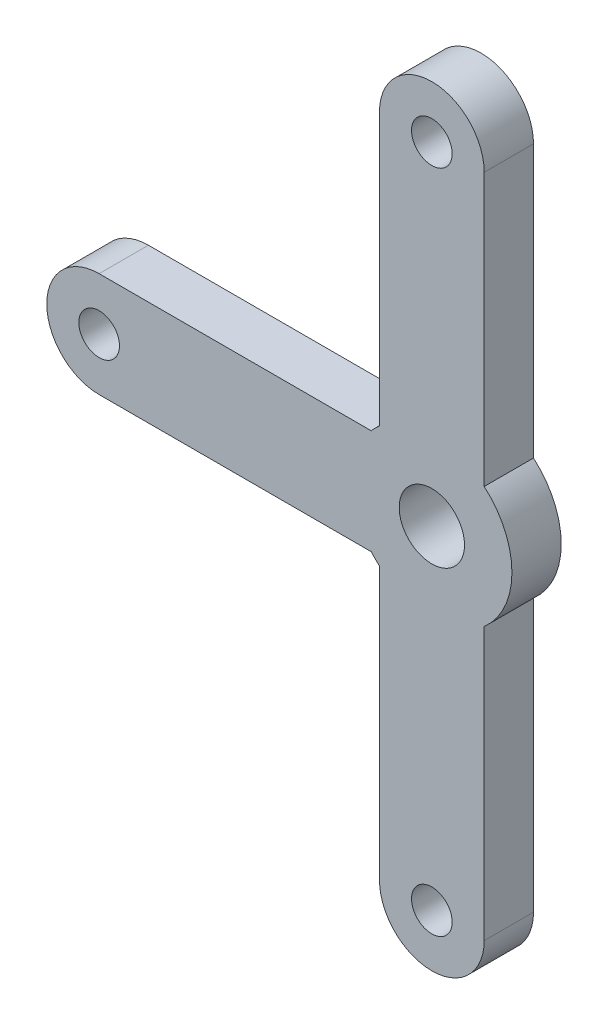
ISO-10303-21;
HEADER;
FILE_DESCRIPTION(('STEP AP214'),'2;1');
FILE_NAME('part.step','',(''),(''),'','','');
FILE_SCHEMA(('AUTOMOTIVE_DESIGN { 1 0 10303 214 1 1 1 1 }'));
ENDSEC;
DATA;
#1=APPLICATION_CONTEXT('core data for automotive mechanical design processes');
#2=APPLICATION_PROTOCOL_DEFINITION('international standard','automotive_design',2000,#1);
#3=PRODUCT_CONTEXT('',#1,'mechanical');
#4=PRODUCT('Part','Part','',(#3));
#5=PRODUCT_RELATED_PRODUCT_CATEGORY('part','',(#4));
#6=PRODUCT_DEFINITION_FORMATION('','',#4);
#7=PRODUCT_DEFINITION_CONTEXT('part definition',#1,'design');
#8=PRODUCT_DEFINITION('design','',#6,#7);
#9=PRODUCT_DEFINITION_SHAPE('','',#8);
#10=(LENGTH_UNIT() NAMED_UNIT(*) SI_UNIT(.MILLI.,.METRE.));
#11=(NAMED_UNIT(*) PLANE_ANGLE_UNIT() SI_UNIT($,.RADIAN.));
#12=(NAMED_UNIT(*) SI_UNIT($,.STERADIAN.) SOLID_ANGLE_UNIT());
#13=UNCERTAINTY_MEASURE_WITH_UNIT(LENGTH_MEASURE(1.E-05),#10,'distance_accuracy_value','');
#14=(GEOMETRIC_REPRESENTATION_CONTEXT(3) GLOBAL_UNCERTAINTY_ASSIGNED_CONTEXT((#13)) GLOBAL_UNIT_ASSIGNED_CONTEXT((#10,
#11,#12)) REPRESENTATION_CONTEXT('',''));
#15=CARTESIAN_POINT('',(0.,0.,0.));
#16=DIRECTION('',(0.,0.,1.));
#17=DIRECTION('',(1.,0.,0.));
#18=AXIS2_PLACEMENT_3D('',#15,#16,#17);
#19=CARTESIAN_POINT('',(0.,0.,8.));
#20=DIRECTION('',(0.,0.,-1.));
#21=DIRECTION('',(-1.,0.,0.));
#22=AXIS2_PLACEMENT_3D('',#19,#20,#21);
#23=CYLINDRICAL_SURFACE('',#22,13.);
#24=DIRECTION('',(0.,0.,-1.));
#25=VECTOR('',#24,1.);
#26=CARTESIAN_POINT('',(-8.5,-9.836157786453,8.));
#27=LINE('',#26,#25);
#28=CARTESIAN_POINT('',(-8.5,-9.836157786453,8.));
#29=VERTEX_POINT('',#28);
#30=CARTESIAN_POINT('',(-8.5,-9.836157786453,0.));
#31=VERTEX_POINT('',#30);
#32=EDGE_CURVE('E60',#29,#31,#27,.T.);
#33=ORIENTED_EDGE('',*,*,#32,.F.);
#34=CARTESIAN_POINT('',(0.,0.,8.));
#35=DIRECTION('',(0.,0.,1.));
#36=DIRECTION('',(1.,0.,0.));
#37=AXIS2_PLACEMENT_3D('',#34,#35,#36);
#38=CIRCLE('',#37,13.);
#39=CARTESIAN_POINT('',(-9.836157786453,-8.5,8.));
#40=VERTEX_POINT('',#39);
#41=EDGE_CURVE('E48',#40,#29,#38,.T.);
#42=ORIENTED_EDGE('',*,*,#41,.F.);
#43=DIRECTION('',(0.,0.,-1.));
#44=VECTOR('',#43,1.);
#45=CARTESIAN_POINT('',(-9.836157786453,-8.5,8.));
#46=LINE('',#45,#44);
#47=CARTESIAN_POINT('',(-9.836157786453,-8.5,0.));
#48=VERTEX_POINT('',#47);
#49=EDGE_CURVE('E187',#48,#40,#46,.F.);
#50=ORIENTED_EDGE('',*,*,#49,.F.);
#51=CARTESIAN_POINT('',(0.,0.,0.));
#52=DIRECTION('',(0.,0.,1.));
#53=DIRECTION('',(1.,0.,0.));
#54=AXIS2_PLACEMENT_3D('',#51,#52,#53);
#55=CIRCLE('',#54,13.);
#56=EDGE_CURVE('E222',#48,#31,#55,.T.);
#57=ORIENTED_EDGE('',*,*,#56,.T.);
#58=EDGE_LOOP('',(#33,#42,#50,#57));
#59=FACE_BOUND('',#58,.T.);
#60=ADVANCED_FACE('F39',(#59),#23,.T.);
#61=DIRECTION('',(0.,0.,-1.));
#62=VECTOR('',#61,1.);
#63=CARTESIAN_POINT('',(8.5,-9.836157786453,8.));
#64=LINE('',#63,#62);
#65=CARTESIAN_POINT('',(8.5,-9.836157786453,0.));
#66=VERTEX_POINT('',#65);
#67=CARTESIAN_POINT('',(8.5,-9.836157786453,8.));
#68=VERTEX_POINT('',#67);
#69=EDGE_CURVE('E61',#66,#68,#64,.F.);
#70=ORIENTED_EDGE('',*,*,#69,.F.);
#71=CARTESIAN_POINT('',(8.5,9.836157786453,0.));
#72=VERTEX_POINT('',#71);
#73=EDGE_CURVE('E220',#66,#72,#55,.T.);
#74=ORIENTED_EDGE('',*,*,#73,.T.);
#75=DIRECTION('',(0.,0.,-1.));
#76=VECTOR('',#75,1.);
#77=CARTESIAN_POINT('',(8.5,9.836157786453,8.));
#78=LINE('',#77,#76);
#79=CARTESIAN_POINT('',(8.5,9.836157786453,8.));
#80=VERTEX_POINT('',#79);
#81=EDGE_CURVE('E214',#80,#72,#78,.T.);
#82=ORIENTED_EDGE('',*,*,#81,.F.);
#83=EDGE_CURVE('E49',#68,#80,#38,.T.);
#84=ORIENTED_EDGE('',*,*,#83,.F.);
#85=EDGE_LOOP('',(#70,#74,#82,#84));
#86=FACE_BOUND('',#85,.T.);
#87=ADVANCED_FACE('F270',(#86),#23,.T.);
#88=DIRECTION('',(0.,0.,-1.));
#89=VECTOR('',#88,1.);
#90=CARTESIAN_POINT('',(-9.836157786453,8.5,8.));
#91=LINE('',#90,#89);
#92=CARTESIAN_POINT('',(-9.836157786453,8.5,8.));
#93=VERTEX_POINT('',#92);
#94=CARTESIAN_POINT('',(-9.836157786453,8.5,0.));
#95=VERTEX_POINT('',#94);
#96=EDGE_CURVE('E189',#93,#95,#91,.T.);
#97=ORIENTED_EDGE('',*,*,#96,.F.);
#98=CARTESIAN_POINT('',(-8.5,9.836157786453,8.));
#99=VERTEX_POINT('',#98);
#100=EDGE_CURVE('E11',#99,#93,#38,.T.);
#101=ORIENTED_EDGE('',*,*,#100,.F.);
#102=DIRECTION('',(0.,0.,-1.));
#103=VECTOR('',#102,1.);
#104=CARTESIAN_POINT('',(-8.5,9.836157786453,8.));
#105=LINE('',#104,#103);
#106=CARTESIAN_POINT('',(-8.5,9.836157786453,0.));
#107=VERTEX_POINT('',#106);
#108=EDGE_CURVE('E215',#107,#99,#105,.F.);
#109=ORIENTED_EDGE('',*,*,#108,.F.);
#110=EDGE_CURVE('E218',#107,#95,#55,.T.);
#111=ORIENTED_EDGE('',*,*,#110,.T.);
#112=EDGE_LOOP('',(#97,#101,#109,#111));
#113=FACE_BOUND('',#112,.T.);
#114=ADVANCED_FACE('F41',(#113),#23,.T.);
#115=CARTESIAN_POINT('',(0.,0.,8.));
#116=DIRECTION('',(0.,0.,1.));
#117=DIRECTION('',(1.,0.,0.));
#118=AXIS2_PLACEMENT_3D('',#115,#116,#117);
#119=PLANE('',#118);
#120=CARTESIAN_POINT('',(0.,0.,8.));
#121=DIRECTION('',(0.,0.,1.));
#122=DIRECTION('',(1.,0.,0.));
#123=AXIS2_PLACEMENT_3D('',#120,#121,#122);
#124=CIRCLE('',#123,5.3);
#125=CARTESIAN_POINT('',(5.3,0.,8.));
#126=VERTEX_POINT('',#125);
#127=EDGE_CURVE('E227',#126,#126,#124,.F.);
#128=ORIENTED_EDGE('',*,*,#127,.T.);
#129=EDGE_LOOP('',(#128));
#130=FACE_BOUND('',#129,.T.);
#131=CARTESIAN_POINT('',(0.,54.,8.));
#132=DIRECTION('',(0.,0.,1.));
#133=DIRECTION('',(1.,0.,0.));
#134=AXIS2_PLACEMENT_3D('',#131,#132,#133);
#135=CIRCLE('',#134,3.3);
#136=CARTESIAN_POINT('',(3.3,54.,8.));
#137=VERTEX_POINT('',#136);
#138=EDGE_CURVE('E159',#137,#137,#135,.F.);
#139=ORIENTED_EDGE('',*,*,#138,.T.);
#140=EDGE_LOOP('',(#139));
#141=FACE_BOUND('',#140,.T.);
#142=CARTESIAN_POINT('',(-54.,0.,8.));
#143=DIRECTION('',(0.,0.,1.));
#144=DIRECTION('',(1.,0.,0.));
#145=AXIS2_PLACEMENT_3D('',#142,#143,#144);
#146=CIRCLE('',#145,3.3);
#147=CARTESIAN_POINT('',(-50.7,0.,8.));
#148=VERTEX_POINT('',#147);
#149=EDGE_CURVE('E229',#148,#148,#146,.F.);
#150=ORIENTED_EDGE('',*,*,#149,.T.);
#151=EDGE_LOOP('',(#150));
#152=FACE_BOUND('',#151,.T.);
#153=CARTESIAN_POINT('',(0.,-54.,8.));
#154=DIRECTION('',(0.,0.,1.));
#155=DIRECTION('',(1.,0.,0.));
#156=AXIS2_PLACEMENT_3D('',#153,#154,#155);
#157=CIRCLE('',#156,3.3);
#158=CARTESIAN_POINT('',(3.3,-54.,8.));
#159=VERTEX_POINT('',#158);
#160=EDGE_CURVE('E223',#159,#159,#157,.F.);
#161=ORIENTED_EDGE('',*,*,#160,.T.);
#162=EDGE_LOOP('',(#161));
#163=FACE_BOUND('',#162,.T.);
#164=ORIENTED_EDGE('',*,*,#41,.T.);
#165=DIRECTION('',(0.,-1.,0.));
#166=VECTOR('',#165,1.);
#167=CARTESIAN_POINT('',(-8.5,-54.,8.));
#168=LINE('',#167,#166);
#169=CARTESIAN_POINT('',(-8.5,-54.,8.));
#170=VERTEX_POINT('',#169);
#171=EDGE_CURVE('E128',#29,#170,#168,.T.);
#172=ORIENTED_EDGE('',*,*,#171,.T.);
#173=CARTESIAN_POINT('',(0.,-54.,8.));
#174=DIRECTION('',(0.,0.,1.));
#175=DIRECTION('',(-1.,0.,0.));
#176=AXIS2_PLACEMENT_3D('',#173,#174,#175);
#177=CIRCLE('',#176,8.5);
#178=CARTESIAN_POINT('',(8.5,-54.,8.));
#179=VERTEX_POINT('',#178);
#180=EDGE_CURVE('E131',#170,#179,#177,.T.);
#181=ORIENTED_EDGE('',*,*,#180,.T.);
#182=DIRECTION('',(0.,1.,0.));
#183=VECTOR('',#182,1.);
#184=CARTESIAN_POINT('',(8.5,0.,8.));
#185=LINE('',#184,#183);
#186=EDGE_CURVE('E153',#179,#68,#185,.T.);
#187=ORIENTED_EDGE('',*,*,#186,.T.);
#188=ORIENTED_EDGE('',*,*,#83,.T.);
#189=DIRECTION('',(0.,1.,0.));
#190=VECTOR('',#189,1.);
#191=CARTESIAN_POINT('',(8.5,54.,8.));
#192=LINE('',#191,#190);
#193=CARTESIAN_POINT('',(8.5,54.,8.));
#194=VERTEX_POINT('',#193);
#195=EDGE_CURVE('E192',#80,#194,#192,.T.);
#196=ORIENTED_EDGE('',*,*,#195,.T.);
#197=CARTESIAN_POINT('',(0.,54.,8.));
#198=DIRECTION('',(0.,0.,1.));
#199=DIRECTION('',(-1.,0.,0.));
#200=AXIS2_PLACEMENT_3D('',#197,#198,#199);
#201=CIRCLE('',#200,8.5);
#202=CARTESIAN_POINT('',(-8.5,54.,8.));
#203=VERTEX_POINT('',#202);
#204=EDGE_CURVE('E194',#194,#203,#201,.T.);
#205=ORIENTED_EDGE('',*,*,#204,.T.);
#206=DIRECTION('',(0.,-1.,0.));
#207=VECTOR('',#206,1.);
#208=CARTESIAN_POINT('',(-8.5,0.,8.));
#209=LINE('',#208,#207);
#210=EDGE_CURVE('E196',#203,#99,#209,.T.);
#211=ORIENTED_EDGE('',*,*,#210,.T.);
#212=ORIENTED_EDGE('',*,*,#100,.T.);
#213=DIRECTION('',(-1.,0.,0.));
#214=VECTOR('',#213,1.);
#215=CARTESIAN_POINT('',(-54.,8.5,8.));
#216=LINE('',#215,#214);
#217=CARTESIAN_POINT('',(-54.,8.5,8.));
#218=VERTEX_POINT('',#217);
#219=EDGE_CURVE('E169',#93,#218,#216,.T.);
#220=ORIENTED_EDGE('',*,*,#219,.T.);
#221=CARTESIAN_POINT('',(-54.,0.,8.));
#222=DIRECTION('',(0.,0.,1.));
#223=DIRECTION('',(-1.,0.,0.));
#224=AXIS2_PLACEMENT_3D('',#221,#222,#223);
#225=CIRCLE('',#224,8.5);
#226=CARTESIAN_POINT('',(-54.,-8.5,8.));
#227=VERTEX_POINT('',#226);
#228=EDGE_CURVE('E168',#218,#227,#225,.T.);
#229=ORIENTED_EDGE('',*,*,#228,.T.);
#230=DIRECTION('',(1.,0.,0.));
#231=VECTOR('',#230,1.);
#232=CARTESIAN_POINT('',(0.,-8.5,8.));
#233=LINE('',#232,#231);
#234=EDGE_CURVE('E173',#227,#40,#233,.T.);
#235=ORIENTED_EDGE('',*,*,#234,.T.);
#236=EDGE_LOOP('',(#164,#172,#181,#187,#188,#196,#205,#211,#212,#220,#229,#235));
#237=FACE_BOUND('',#236,.T.);
#238=ADVANCED_FACE('F135',(#130,#141,#152,#163,#237),#119,.T.);
#239=CARTESIAN_POINT('',(0.,0.,0.));
#240=DIRECTION('',(0.,0.,1.));
#241=DIRECTION('',(1.,0.,0.));
#242=AXIS2_PLACEMENT_3D('',#239,#240,#241);
#243=PLANE('',#242);
#244=CARTESIAN_POINT('',(0.,0.,0.));
#245=DIRECTION('',(0.,0.,1.));
#246=DIRECTION('',(1.,0.,0.));
#247=AXIS2_PLACEMENT_3D('',#244,#245,#246);
#248=CIRCLE('',#247,5.3);
#249=CARTESIAN_POINT('',(5.3,0.,0.));
#250=VERTEX_POINT('',#249);
#251=EDGE_CURVE('E43',#250,#250,#248,.F.);
#252=ORIENTED_EDGE('',*,*,#251,.F.);
#253=EDGE_LOOP('',(#252));
#254=FACE_BOUND('',#253,.T.);
#255=CARTESIAN_POINT('',(0.,54.,0.));
#256=DIRECTION('',(0.,0.,1.));
#257=DIRECTION('',(1.,0.,0.));
#258=AXIS2_PLACEMENT_3D('',#255,#256,#257);
#259=CIRCLE('',#258,3.3);
#260=CARTESIAN_POINT('',(3.3,54.,0.));
#261=VERTEX_POINT('',#260);
#262=EDGE_CURVE('E226',#261,#261,#259,.F.);
#263=ORIENTED_EDGE('',*,*,#262,.F.);
#264=EDGE_LOOP('',(#263));
#265=FACE_BOUND('',#264,.T.);
#266=CARTESIAN_POINT('',(-54.,0.,0.));
#267=DIRECTION('',(0.,0.,1.));
#268=DIRECTION('',(1.,0.,0.));
#269=AXIS2_PLACEMENT_3D('',#266,#267,#268);
#270=CIRCLE('',#269,3.3);
#271=CARTESIAN_POINT('',(-50.7,0.,0.));
#272=VERTEX_POINT('',#271);
#273=EDGE_CURVE('E230',#272,#272,#270,.F.);
#274=ORIENTED_EDGE('',*,*,#273,.F.);
#275=EDGE_LOOP('',(#274));
#276=FACE_BOUND('',#275,.T.);
#277=CARTESIAN_POINT('',(0.,-54.,0.));
#278=DIRECTION('',(0.,0.,1.));
#279=DIRECTION('',(1.,0.,0.));
#280=AXIS2_PLACEMENT_3D('',#277,#278,#279);
#281=CIRCLE('',#280,3.3);
#282=CARTESIAN_POINT('',(3.3,-54.,0.));
#283=VERTEX_POINT('',#282);
#284=EDGE_CURVE('E225',#283,#283,#281,.F.);
#285=ORIENTED_EDGE('',*,*,#284,.F.);
#286=EDGE_LOOP('',(#285));
#287=FACE_BOUND('',#286,.T.);
#288=ORIENTED_EDGE('',*,*,#73,.F.);
#289=DIRECTION('',(0.,1.,0.));
#290=VECTOR('',#289,1.);
#291=CARTESIAN_POINT('',(8.5,0.,0.));
#292=LINE('',#291,#290);
#293=CARTESIAN_POINT('',(8.5,-54.,0.));
#294=VERTEX_POINT('',#293);
#295=EDGE_CURVE('E138',#294,#66,#292,.T.);
#296=ORIENTED_EDGE('',*,*,#295,.F.);
#297=CARTESIAN_POINT('',(0.,-54.,0.));
#298=DIRECTION('',(0.,0.,1.));
#299=DIRECTION('',(-1.,0.,0.));
#300=AXIS2_PLACEMENT_3D('',#297,#298,#299);
#301=CIRCLE('',#300,8.5);
#302=CARTESIAN_POINT('',(-8.5,-54.,0.));
#303=VERTEX_POINT('',#302);
#304=EDGE_CURVE('E157',#303,#294,#301,.T.);
#305=ORIENTED_EDGE('',*,*,#304,.F.);
#306=DIRECTION('',(0.,-1.,0.));
#307=VECTOR('',#306,1.);
#308=CARTESIAN_POINT('',(-8.5,-54.,0.));
#309=LINE('',#308,#307);
#310=EDGE_CURVE('E144',#31,#303,#309,.T.);
#311=ORIENTED_EDGE('',*,*,#310,.F.);
#312=ORIENTED_EDGE('',*,*,#56,.F.);
#313=DIRECTION('',(1.,0.,0.));
#314=VECTOR('',#313,1.);
#315=CARTESIAN_POINT('',(0.,-8.5,0.));
#316=LINE('',#315,#314);
#317=CARTESIAN_POINT('',(-54.,-8.5,0.));
#318=VERTEX_POINT('',#317);
#319=EDGE_CURVE('E172',#318,#48,#316,.T.);
#320=ORIENTED_EDGE('',*,*,#319,.F.);
#321=CARTESIAN_POINT('',(-54.,0.,0.));
#322=DIRECTION('',(0.,0.,1.));
#323=DIRECTION('',(-1.,0.,0.));
#324=AXIS2_PLACEMENT_3D('',#321,#322,#323);
#325=CIRCLE('',#324,8.5);
#326=CARTESIAN_POINT('',(-54.,8.5,0.));
#327=VERTEX_POINT('',#326);
#328=EDGE_CURVE('E180',#327,#318,#325,.T.);
#329=ORIENTED_EDGE('',*,*,#328,.F.);
#330=DIRECTION('',(-1.,0.,0.));
#331=VECTOR('',#330,1.);
#332=CARTESIAN_POINT('',(-54.,8.5,0.));
#333=LINE('',#332,#331);
#334=EDGE_CURVE('E170',#95,#327,#333,.T.);
#335=ORIENTED_EDGE('',*,*,#334,.F.);
#336=ORIENTED_EDGE('',*,*,#110,.F.);
#337=DIRECTION('',(0.,-1.,0.));
#338=VECTOR('',#337,1.);
#339=CARTESIAN_POINT('',(-8.5,0.,0.));
#340=LINE('',#339,#338);
#341=CARTESIAN_POINT('',(-8.5,54.,0.));
#342=VERTEX_POINT('',#341);
#343=EDGE_CURVE('E198',#342,#107,#340,.T.);
#344=ORIENTED_EDGE('',*,*,#343,.F.);
#345=CARTESIAN_POINT('',(0.,54.,0.));
#346=DIRECTION('',(0.,0.,1.));
#347=DIRECTION('',(-1.,0.,0.));
#348=AXIS2_PLACEMENT_3D('',#345,#346,#347);
#349=CIRCLE('',#348,8.5);
#350=CARTESIAN_POINT('',(8.5,54.,0.));
#351=VERTEX_POINT('',#350);
#352=EDGE_CURVE('E201',#351,#342,#349,.T.);
#353=ORIENTED_EDGE('',*,*,#352,.F.);
#354=DIRECTION('',(0.,1.,0.));
#355=VECTOR('',#354,1.);
#356=CARTESIAN_POINT('',(8.5,54.,0.));
#357=LINE('',#356,#355);
#358=EDGE_CURVE('E195',#72,#351,#357,.T.);
#359=ORIENTED_EDGE('',*,*,#358,.F.);
#360=EDGE_LOOP('',(#288,#296,#305,#311,#312,#320,#329,#335,#336,#344,#353,#359));
#361=FACE_BOUND('',#360,.T.);
#362=ADVANCED_FACE('F249',(#254,#265,#276,#287,#361),#243,.F.);
#363=CARTESIAN_POINT('',(8.5,54.,8.));
#364=DIRECTION('',(-1.,0.,0.));
#365=DIRECTION('',(0.,0.,1.));
#366=AXIS2_PLACEMENT_3D('',#363,#364,#365);
#367=PLANE('',#366);
#368=ORIENTED_EDGE('',*,*,#195,.F.);
#369=ORIENTED_EDGE('',*,*,#81,.T.);
#370=ORIENTED_EDGE('',*,*,#358,.T.);
#371=DIRECTION('',(0.,0.,-1.));
#372=VECTOR('',#371,1.);
#373=CARTESIAN_POINT('',(8.5,54.,8.));
#374=LINE('',#373,#372);
#375=EDGE_CURVE('E207',#194,#351,#374,.T.);
#376=ORIENTED_EDGE('',*,*,#375,.F.);
#377=EDGE_LOOP('',(#368,#369,#370,#376));
#378=FACE_BOUND('',#377,.T.);
#379=ADVANCED_FACE('F251',(#378),#367,.F.);
#380=CARTESIAN_POINT('',(-8.5,0.,8.));
#381=DIRECTION('',(1.,0.,0.));
#382=DIRECTION('',(0.,0.,-1.));
#383=AXIS2_PLACEMENT_3D('',#380,#381,#382);
#384=PLANE('',#383);
#385=ORIENTED_EDGE('',*,*,#343,.T.);
#386=ORIENTED_EDGE('',*,*,#108,.T.);
#387=ORIENTED_EDGE('',*,*,#210,.F.);
#388=DIRECTION('',(0.,0.,-1.));
#389=VECTOR('',#388,1.);
#390=CARTESIAN_POINT('',(-8.5,54.,8.));
#391=LINE('',#390,#389);
#392=EDGE_CURVE('E203',#203,#342,#391,.T.);
#393=ORIENTED_EDGE('',*,*,#392,.T.);
#394=EDGE_LOOP('',(#385,#386,#387,#393));
#395=FACE_BOUND('',#394,.T.);
#396=ADVANCED_FACE('F277',(#395),#384,.F.);
#397=CARTESIAN_POINT('',(0.,54.,8.));
#398=DIRECTION('',(0.,0.,-1.));
#399=DIRECTION('',(-1.,0.,0.));
#400=AXIS2_PLACEMENT_3D('',#397,#398,#399);
#401=CYLINDRICAL_SURFACE('',#400,8.5);
#402=ORIENTED_EDGE('',*,*,#352,.T.);
#403=ORIENTED_EDGE('',*,*,#392,.F.);
#404=ORIENTED_EDGE('',*,*,#204,.F.);
#405=ORIENTED_EDGE('',*,*,#375,.T.);
#406=EDGE_LOOP('',(#402,#403,#404,#405));
#407=FACE_BOUND('',#406,.T.);
#408=ADVANCED_FACE('F275',(#407),#401,.T.);
#409=CARTESIAN_POINT('',(-54.,8.5,8.));
#410=DIRECTION('',(0.,-1.,0.));
#411=DIRECTION('',(0.,0.,-1.));
#412=AXIS2_PLACEMENT_3D('',#409,#410,#411);
#413=PLANE('',#412);
#414=ORIENTED_EDGE('',*,*,#219,.F.);
#415=ORIENTED_EDGE('',*,*,#96,.T.);
#416=ORIENTED_EDGE('',*,*,#334,.T.);
#417=DIRECTION('',(0.,0.,-1.));
#418=VECTOR('',#417,1.);
#419=CARTESIAN_POINT('',(-54.,8.5,8.));
#420=LINE('',#419,#418);
#421=EDGE_CURVE('E181',#218,#327,#420,.T.);
#422=ORIENTED_EDGE('',*,*,#421,.F.);
#423=EDGE_LOOP('',(#414,#415,#416,#422));
#424=FACE_BOUND('',#423,.T.);
#425=ADVANCED_FACE('F281',(#424),#413,.F.);
#426=CARTESIAN_POINT('',(0.,-8.5,8.));
#427=DIRECTION('',(0.,1.,0.));
#428=DIRECTION('',(0.,0.,1.));
#429=AXIS2_PLACEMENT_3D('',#426,#427,#428);
#430=PLANE('',#429);
#431=ORIENTED_EDGE('',*,*,#319,.T.);
#432=ORIENTED_EDGE('',*,*,#49,.T.);
#433=ORIENTED_EDGE('',*,*,#234,.F.);
#434=DIRECTION('',(0.,0.,-1.));
#435=VECTOR('',#434,1.);
#436=CARTESIAN_POINT('',(-54.,-8.5,8.));
#437=LINE('',#436,#435);
#438=EDGE_CURVE('E171',#227,#318,#437,.T.);
#439=ORIENTED_EDGE('',*,*,#438,.T.);
#440=EDGE_LOOP('',(#431,#432,#433,#439));
#441=FACE_BOUND('',#440,.T.);
#442=ADVANCED_FACE('F295',(#441),#430,.F.);
#443=CARTESIAN_POINT('',(-54.,0.,8.));
#444=DIRECTION('',(0.,0.,-1.));
#445=DIRECTION('',(-1.,0.,0.));
#446=AXIS2_PLACEMENT_3D('',#443,#444,#445);
#447=CYLINDRICAL_SURFACE('',#446,8.5);
#448=ORIENTED_EDGE('',*,*,#328,.T.);
#449=ORIENTED_EDGE('',*,*,#438,.F.);
#450=ORIENTED_EDGE('',*,*,#228,.F.);
#451=ORIENTED_EDGE('',*,*,#421,.T.);
#452=EDGE_LOOP('',(#448,#449,#450,#451));
#453=FACE_BOUND('',#452,.T.);
#454=ADVANCED_FACE('F287',(#453),#447,.T.);
#455=CARTESIAN_POINT('',(-8.5,-54.,8.));
#456=DIRECTION('',(1.,0.,0.));
#457=DIRECTION('',(0.,0.,-1.));
#458=AXIS2_PLACEMENT_3D('',#455,#456,#457);
#459=PLANE('',#458);
#460=ORIENTED_EDGE('',*,*,#171,.F.);
#461=ORIENTED_EDGE('',*,*,#32,.T.);
#462=ORIENTED_EDGE('',*,*,#310,.T.);
#463=DIRECTION('',(0.,0.,-1.));
#464=VECTOR('',#463,1.);
#465=CARTESIAN_POINT('',(-8.5,-54.,8.));
#466=LINE('',#465,#464);
#467=EDGE_CURVE('E142',#170,#303,#466,.T.);
#468=ORIENTED_EDGE('',*,*,#467,.F.);
#469=EDGE_LOOP('',(#460,#461,#462,#468));
#470=FACE_BOUND('',#469,.T.);
#471=ADVANCED_FACE('F141',(#470),#459,.F.);
#472=CARTESIAN_POINT('',(8.5,0.,8.));
#473=DIRECTION('',(-1.,0.,0.));
#474=DIRECTION('',(0.,0.,1.));
#475=AXIS2_PLACEMENT_3D('',#472,#473,#474);
#476=PLANE('',#475);
#477=ORIENTED_EDGE('',*,*,#295,.T.);
#478=ORIENTED_EDGE('',*,*,#69,.T.);
#479=ORIENTED_EDGE('',*,*,#186,.F.);
#480=DIRECTION('',(0.,0.,-1.));
#481=VECTOR('',#480,1.);
#482=CARTESIAN_POINT('',(8.5,-54.,8.));
#483=LINE('',#482,#481);
#484=EDGE_CURVE('E146',#179,#294,#483,.T.);
#485=ORIENTED_EDGE('',*,*,#484,.T.);
#486=EDGE_LOOP('',(#477,#478,#479,#485));
#487=FACE_BOUND('',#486,.T.);
#488=ADVANCED_FACE('F262',(#487),#476,.F.);
#489=CARTESIAN_POINT('',(0.,-54.,8.));
#490=DIRECTION('',(0.,0.,-1.));
#491=DIRECTION('',(-1.,0.,0.));
#492=AXIS2_PLACEMENT_3D('',#489,#490,#491);
#493=CYLINDRICAL_SURFACE('',#492,8.5);
#494=ORIENTED_EDGE('',*,*,#304,.T.);
#495=ORIENTED_EDGE('',*,*,#484,.F.);
#496=ORIENTED_EDGE('',*,*,#180,.F.);
#497=ORIENTED_EDGE('',*,*,#467,.T.);
#498=EDGE_LOOP('',(#494,#495,#496,#497));
#499=FACE_BOUND('',#498,.T.);
#500=ADVANCED_FACE('F147',(#499),#493,.T.);
#501=CARTESIAN_POINT('',(0.,-54.,9.));
#502=DIRECTION('',(0.,0.,-1.));
#503=DIRECTION('',(-1.,0.,0.));
#504=AXIS2_PLACEMENT_3D('',#501,#502,#503);
#505=CYLINDRICAL_SURFACE('',#504,3.3);
#506=ORIENTED_EDGE('',*,*,#160,.F.);
#507=EDGE_LOOP('',(#506));
#508=FACE_BOUND('',#507,.T.);
#509=ORIENTED_EDGE('',*,*,#284,.T.);
#510=EDGE_LOOP('',(#509));
#511=FACE_BOUND('',#510,.T.);
#512=ADVANCED_FACE('F322',(#508,#511),#505,.F.);
#513=CARTESIAN_POINT('',(-54.,0.,9.));
#514=DIRECTION('',(0.,0.,-1.));
#515=DIRECTION('',(-1.,0.,0.));
#516=AXIS2_PLACEMENT_3D('',#513,#514,#515);
#517=CYLINDRICAL_SURFACE('',#516,3.3);
#518=ORIENTED_EDGE('',*,*,#149,.F.);
#519=EDGE_LOOP('',(#518));
#520=FACE_BOUND('',#519,.T.);
#521=ORIENTED_EDGE('',*,*,#273,.T.);
#522=EDGE_LOOP('',(#521));
#523=FACE_BOUND('',#522,.T.);
#524=ADVANCED_FACE('F328',(#520,#523),#517,.F.);
#525=CARTESIAN_POINT('',(0.,54.,9.));
#526=DIRECTION('',(0.,0.,-1.));
#527=DIRECTION('',(-1.,0.,0.));
#528=AXIS2_PLACEMENT_3D('',#525,#526,#527);
#529=CYLINDRICAL_SURFACE('',#528,3.3);
#530=ORIENTED_EDGE('',*,*,#138,.F.);
#531=EDGE_LOOP('',(#530));
#532=FACE_BOUND('',#531,.T.);
#533=ORIENTED_EDGE('',*,*,#262,.T.);
#534=EDGE_LOOP('',(#533));
#535=FACE_BOUND('',#534,.T.);
#536=ADVANCED_FACE('F334',(#532,#535),#529,.F.);
#537=CARTESIAN_POINT('',(0.,0.,9.));
#538=DIRECTION('',(0.,0.,-1.));
#539=DIRECTION('',(-1.,0.,0.));
#540=AXIS2_PLACEMENT_3D('',#537,#538,#539);
#541=CYLINDRICAL_SURFACE('',#540,5.3);
#542=ORIENTED_EDGE('',*,*,#127,.F.);
#543=EDGE_LOOP('',(#542));
#544=FACE_BOUND('',#543,.T.);
#545=ORIENTED_EDGE('',*,*,#251,.T.);
#546=EDGE_LOOP('',(#545));
#547=FACE_BOUND('',#546,.T.);
#548=ADVANCED_FACE('F247',(#544,#547),#541,.F.);
#549=CLOSED_SHELL('',(#60,#87,#114,#238,#362,#379,#396,#408,#425,#442,#454,#471,#488,#500,#512,
#524,#536,#548));
#550=MANIFOLD_SOLID_BREP('B2',#549);
#551=ADVANCED_BREP_SHAPE_REPRESENTATION('',(#18,#550),#14);
#552=SHAPE_DEFINITION_REPRESENTATION(#9,#551);
ENDSEC;
END-ISO-10303-21;
